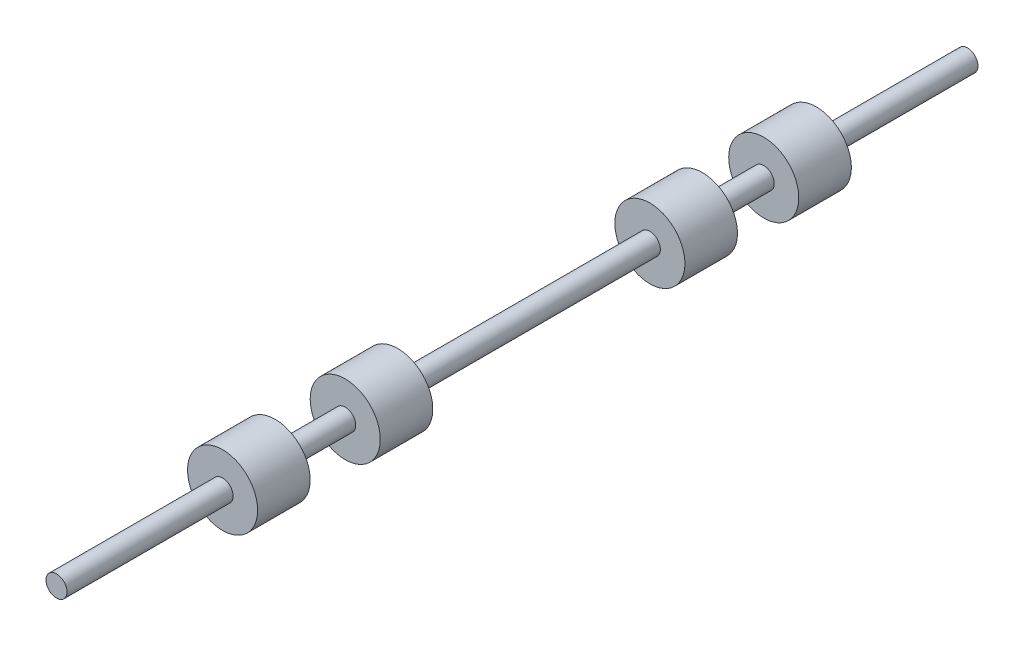
ISO-10303-21;
HEADER;
FILE_DESCRIPTION(('STEP AP214'),'2;1');
FILE_NAME('part.step','',(''),(''),'','','');
FILE_SCHEMA(('AUTOMOTIVE_DESIGN { 1 0 10303 214 1 1 1 1 }'));
ENDSEC;
DATA;
#1=APPLICATION_CONTEXT('core data for automotive mechanical design processes');
#2=APPLICATION_PROTOCOL_DEFINITION('international standard','automotive_design',2000,#1);
#3=PRODUCT_CONTEXT('',#1,'mechanical');
#4=PRODUCT('Part','Part','',(#3));
#5=PRODUCT_RELATED_PRODUCT_CATEGORY('part','',(#4));
#6=PRODUCT_DEFINITION_FORMATION('','',#4);
#7=PRODUCT_DEFINITION_CONTEXT('part definition',#1,'design');
#8=PRODUCT_DEFINITION('design','',#6,#7);
#9=PRODUCT_DEFINITION_SHAPE('','',#8);
#10=(LENGTH_UNIT() NAMED_UNIT(*) SI_UNIT(.MILLI.,.METRE.));
#11=(NAMED_UNIT(*) PLANE_ANGLE_UNIT() SI_UNIT($,.RADIAN.));
#12=(NAMED_UNIT(*) SI_UNIT($,.STERADIAN.) SOLID_ANGLE_UNIT());
#13=UNCERTAINTY_MEASURE_WITH_UNIT(LENGTH_MEASURE(1.E-05),#10,'distance_accuracy_value','');
#14=(GEOMETRIC_REPRESENTATION_CONTEXT(3) GLOBAL_UNCERTAINTY_ASSIGNED_CONTEXT((#13)) GLOBAL_UNIT_ASSIGNED_CONTEXT((#10,
#11,#12)) REPRESENTATION_CONTEXT('',''));
#15=CARTESIAN_POINT('',(0.,0.,0.));
#16=DIRECTION('',(0.,0.,1.));
#17=DIRECTION('',(1.,0.,0.));
#18=AXIS2_PLACEMENT_3D('',#15,#16,#17);
#19=CARTESIAN_POINT('',(0.,0.,26.));
#20=DIRECTION('',(0.,0.,-1.));
#21=DIRECTION('',(-1.,0.,0.));
#22=AXIS2_PLACEMENT_3D('',#19,#20,#21);
#23=CYLINDRICAL_SURFACE('',#22,0.3);
#24=CARTESIAN_POINT('',(0.,0.,17.76));
#25=DIRECTION('',(0.,0.,-1.));
#26=DIRECTION('',(-1.,0.,0.));
#27=AXIS2_PLACEMENT_3D('',#24,#25,#26);
#28=CIRCLE('',#27,0.3);
#29=CARTESIAN_POINT('',(-0.3,0.,17.76));
#30=VERTEX_POINT('',#29);
#31=EDGE_CURVE('E42',#30,#30,#28,.T.);
#32=ORIENTED_EDGE('',*,*,#31,.F.);
#33=EDGE_LOOP('',(#32));
#34=FACE_BOUND('',#33,.T.);
#35=CARTESIAN_POINT('',(0.,0.,19.76));
#36=DIRECTION('',(0.,0.,1.));
#37=DIRECTION('',(1.,0.,0.));
#38=AXIS2_PLACEMENT_3D('',#35,#36,#37);
#39=CIRCLE('',#38,0.3);
#40=CARTESIAN_POINT('',(0.3,0.,19.76));
#41=VERTEX_POINT('',#40);
#42=EDGE_CURVE('E38',#41,#41,#39,.T.);
#43=ORIENTED_EDGE('',*,*,#42,.F.);
#44=EDGE_LOOP('',(#43));
#45=FACE_BOUND('',#44,.T.);
#46=ADVANCED_FACE('F31',(#34,#45),#23,.T.);
#47=CARTESIAN_POINT('',(0.,0.,9.06498723388908));
#48=DIRECTION('',(0.,0.,-1.));
#49=DIRECTION('',(-1.,0.,0.));
#50=AXIS2_PLACEMENT_3D('',#47,#48,#49);
#51=CIRCLE('',#50,0.3);
#52=CARTESIAN_POINT('',(-0.3,0.,9.06498723388908));
#53=VERTEX_POINT('',#52);
#54=EDGE_CURVE('E51',#53,#53,#51,.T.);
#55=ORIENTED_EDGE('',*,*,#54,.F.);
#56=EDGE_LOOP('',(#55));
#57=FACE_BOUND('',#56,.T.);
#58=CARTESIAN_POINT('',(0.,0.,16.26));
#59=DIRECTION('',(0.,0.,1.));
#60=DIRECTION('',(1.,0.,0.));
#61=AXIS2_PLACEMENT_3D('',#58,#59,#60);
#62=CIRCLE('',#61,0.3);
#63=CARTESIAN_POINT('',(0.3,0.,16.26));
#64=VERTEX_POINT('',#63);
#65=EDGE_CURVE('E46',#64,#64,#62,.T.);
#66=ORIENTED_EDGE('',*,*,#65,.F.);
#67=EDGE_LOOP('',(#66));
#68=FACE_BOUND('',#67,.T.);
#69=ADVANCED_FACE('F113',(#57,#68),#23,.T.);
#70=CARTESIAN_POINT('',(0.,0.,5.81501276611092));
#71=DIRECTION('',(0.,0.,-1.));
#72=DIRECTION('',(-1.,0.,0.));
#73=AXIS2_PLACEMENT_3D('',#70,#71,#72);
#74=CIRCLE('',#73,0.3);
#75=CARTESIAN_POINT('',(-0.3,0.,5.81501276611092));
#76=VERTEX_POINT('',#75);
#77=EDGE_CURVE('E57',#76,#76,#74,.T.);
#78=ORIENTED_EDGE('',*,*,#77,.F.);
#79=EDGE_LOOP('',(#78));
#80=FACE_BOUND('',#79,.T.);
#81=CARTESIAN_POINT('',(0.,0.,7.56498723388908));
#82=DIRECTION('',(0.,0.,1.));
#83=DIRECTION('',(1.,0.,0.));
#84=AXIS2_PLACEMENT_3D('',#81,#82,#83);
#85=CIRCLE('',#84,0.3);
#86=CARTESIAN_POINT('',(0.3,0.,7.56498723388908));
#87=VERTEX_POINT('',#86);
#88=EDGE_CURVE('E54',#87,#87,#85,.T.);
#89=ORIENTED_EDGE('',*,*,#88,.F.);
#90=EDGE_LOOP('',(#89));
#91=FACE_BOUND('',#90,.T.);
#92=ADVANCED_FACE('F118',(#80,#91),#23,.T.);
#93=CARTESIAN_POINT('',(0.,0.,5.81501276611092));
#94=DIRECTION('',(0.,0.,-1.));
#95=DIRECTION('',(-1.,0.,0.));
#96=AXIS2_PLACEMENT_3D('',#93,#94,#95);
#97=PLANE('',#96);
#98=ORIENTED_EDGE('',*,*,#77,.T.);
#99=EDGE_LOOP('',(#98));
#100=FACE_BOUND('',#99,.T.);
#101=CARTESIAN_POINT('',(0.,0.,5.81501276611092));
#102=DIRECTION('',(0.,0.,-1.));
#103=DIRECTION('',(-1.,0.,0.));
#104=AXIS2_PLACEMENT_3D('',#101,#102,#103);
#105=CIRCLE('',#104,1.);
#106=CARTESIAN_POINT('',(-1.,0.,5.81501276611092));
#107=VERTEX_POINT('',#106);
#108=EDGE_CURVE('E67',#107,#107,#105,.T.);
#109=ORIENTED_EDGE('',*,*,#108,.F.);
#110=EDGE_LOOP('',(#109));
#111=FACE_BOUND('',#110,.T.);
#112=ADVANCED_FACE('F148',(#100,#111),#97,.F.);
#113=CARTESIAN_POINT('',(0.,0.,0.));
#114=DIRECTION('',(0.,0.,-1.));
#115=DIRECTION('',(-1.,0.,0.));
#116=AXIS2_PLACEMENT_3D('',#113,#114,#115);
#117=CYLINDRICAL_SURFACE('',#116,1.);
#118=CARTESIAN_POINT('',(0.,0.,4.31501276611092));
#119=DIRECTION('',(0.,0.,-1.));
#120=DIRECTION('',(-1.,0.,0.));
#121=AXIS2_PLACEMENT_3D('',#118,#119,#120);
#122=CIRCLE('',#121,1.);
#123=CARTESIAN_POINT('',(-1.,0.,4.31501276611092));
#124=VERTEX_POINT('',#123);
#125=EDGE_CURVE('E72',#124,#124,#122,.T.);
#126=ORIENTED_EDGE('',*,*,#125,.F.);
#127=EDGE_LOOP('',(#126));
#128=FACE_BOUND('',#127,.T.);
#129=ORIENTED_EDGE('',*,*,#108,.T.);
#130=EDGE_LOOP('',(#129));
#131=FACE_BOUND('',#130,.T.);
#132=ADVANCED_FACE('F153',(#128,#131),#117,.T.);
#133=CARTESIAN_POINT('',(0.,0.,4.31501276611092));
#134=DIRECTION('',(0.,0.,1.));
#135=DIRECTION('',(1.,0.,0.));
#136=AXIS2_PLACEMENT_3D('',#133,#134,#135);
#137=PLANE('',#136);
#138=CARTESIAN_POINT('',(0.,0.,4.31501276611092));
#139=DIRECTION('',(0.,0.,1.));
#140=DIRECTION('',(1.,0.,0.));
#141=AXIS2_PLACEMENT_3D('',#138,#139,#140);
#142=CIRCLE('',#141,0.3);
#143=CARTESIAN_POINT('',(0.3,0.,4.31501276611092));
#144=VERTEX_POINT('',#143);
#145=EDGE_CURVE('E60',#144,#144,#142,.T.);
#146=ORIENTED_EDGE('',*,*,#145,.T.);
#147=EDGE_LOOP('',(#146));
#148=FACE_BOUND('',#147,.T.);
#149=ORIENTED_EDGE('',*,*,#125,.T.);
#150=EDGE_LOOP('',(#149));
#151=FACE_BOUND('',#150,.T.);
#152=ADVANCED_FACE('F144',(#148,#151),#137,.F.);
#153=CARTESIAN_POINT('',(0.,0.,0.));
#154=DIRECTION('',(0.,0.,1.));
#155=DIRECTION('',(1.,0.,0.));
#156=AXIS2_PLACEMENT_3D('',#153,#154,#155);
#157=PLANE('',#156);
#158=CARTESIAN_POINT('',(0.,0.,0.));
#159=DIRECTION('',(0.,0.,1.));
#160=DIRECTION('',(1.,0.,0.));
#161=AXIS2_PLACEMENT_3D('',#158,#159,#160);
#162=CIRCLE('',#161,0.3);
#163=CARTESIAN_POINT('',(0.3,0.,0.));
#164=VERTEX_POINT('',#163);
#165=EDGE_CURVE('E64',#164,#164,#162,.T.);
#166=ORIENTED_EDGE('',*,*,#165,.F.);
#167=EDGE_LOOP('',(#166));
#168=FACE_BOUND('',#167,.T.);
#169=ADVANCED_FACE('F135',(#168),#157,.F.);
#170=ORIENTED_EDGE('',*,*,#165,.T.);
#171=EDGE_LOOP('',(#170));
#172=FACE_BOUND('',#171,.T.);
#173=ORIENTED_EDGE('',*,*,#145,.F.);
#174=EDGE_LOOP('',(#173));
#175=FACE_BOUND('',#174,.T.);
#176=ADVANCED_FACE('F125',(#172,#175),#23,.T.);
#177=CARTESIAN_POINT('',(0.,0.,9.06498723388908));
#178=DIRECTION('',(0.,0.,-1.));
#179=DIRECTION('',(-1.,0.,0.));
#180=AXIS2_PLACEMENT_3D('',#177,#178,#179);
#181=PLANE('',#180);
#182=ORIENTED_EDGE('',*,*,#54,.T.);
#183=EDGE_LOOP('',(#182));
#184=FACE_BOUND('',#183,.T.);
#185=CARTESIAN_POINT('',(0.,0.,9.06498723388908));
#186=DIRECTION('',(0.,0.,-1.));
#187=DIRECTION('',(-1.,0.,0.));
#188=AXIS2_PLACEMENT_3D('',#185,#186,#187);
#189=CIRCLE('',#188,1.);
#190=CARTESIAN_POINT('',(-1.,0.,9.06498723388908));
#191=VERTEX_POINT('',#190);
#192=EDGE_CURVE('E75',#191,#191,#189,.T.);
#193=ORIENTED_EDGE('',*,*,#192,.F.);
#194=EDGE_LOOP('',(#193));
#195=FACE_BOUND('',#194,.T.);
#196=ADVANCED_FACE('F134',(#184,#195),#181,.F.);
#197=CARTESIAN_POINT('',(0.,0.,0.));
#198=DIRECTION('',(0.,0.,-1.));
#199=DIRECTION('',(-1.,0.,0.));
#200=AXIS2_PLACEMENT_3D('',#197,#198,#199);
#201=CYLINDRICAL_SURFACE('',#200,1.);
#202=CARTESIAN_POINT('',(0.,0.,7.56498723388908));
#203=DIRECTION('',(0.,0.,-1.));
#204=DIRECTION('',(-1.,0.,0.));
#205=AXIS2_PLACEMENT_3D('',#202,#203,#204);
#206=CIRCLE('',#205,1.);
#207=CARTESIAN_POINT('',(-1.,0.,7.56498723388908));
#208=VERTEX_POINT('',#207);
#209=EDGE_CURVE('E78',#208,#208,#206,.T.);
#210=ORIENTED_EDGE('',*,*,#209,.F.);
#211=EDGE_LOOP('',(#210));
#212=FACE_BOUND('',#211,.T.);
#213=ORIENTED_EDGE('',*,*,#192,.T.);
#214=EDGE_LOOP('',(#213));
#215=FACE_BOUND('',#214,.T.);
#216=ADVANCED_FACE('F141',(#212,#215),#201,.T.);
#217=CARTESIAN_POINT('',(0.,0.,7.56498723388908));
#218=DIRECTION('',(0.,0.,1.));
#219=DIRECTION('',(1.,0.,0.));
#220=AXIS2_PLACEMENT_3D('',#217,#218,#219);
#221=PLANE('',#220);
#222=ORIENTED_EDGE('',*,*,#88,.T.);
#223=EDGE_LOOP('',(#222));
#224=FACE_BOUND('',#223,.T.);
#225=ORIENTED_EDGE('',*,*,#209,.T.);
#226=EDGE_LOOP('',(#225));
#227=FACE_BOUND('',#226,.T.);
#228=ADVANCED_FACE('F160',(#224,#227),#221,.F.);
#229=CARTESIAN_POINT('',(0.,0.,17.76));
#230=DIRECTION('',(0.,0.,-1.));
#231=DIRECTION('',(-1.,0.,0.));
#232=AXIS2_PLACEMENT_3D('',#229,#230,#231);
#233=PLANE('',#232);
#234=ORIENTED_EDGE('',*,*,#31,.T.);
#235=EDGE_LOOP('',(#234));
#236=FACE_BOUND('',#235,.T.);
#237=CARTESIAN_POINT('',(0.,0.,17.76));
#238=DIRECTION('',(0.,0.,-1.));
#239=DIRECTION('',(-1.,0.,0.));
#240=AXIS2_PLACEMENT_3D('',#237,#238,#239);
#241=CIRCLE('',#240,1.);
#242=CARTESIAN_POINT('',(-1.,0.,17.76));
#243=VERTEX_POINT('',#242);
#244=EDGE_CURVE('E81',#243,#243,#241,.T.);
#245=ORIENTED_EDGE('',*,*,#244,.F.);
#246=EDGE_LOOP('',(#245));
#247=FACE_BOUND('',#246,.T.);
#248=ADVANCED_FACE('F163',(#236,#247),#233,.F.);
#249=CARTESIAN_POINT('',(0.,0.,0.));
#250=DIRECTION('',(0.,0.,-1.));
#251=DIRECTION('',(-1.,0.,0.));
#252=AXIS2_PLACEMENT_3D('',#249,#250,#251);
#253=CYLINDRICAL_SURFACE('',#252,1.);
#254=CARTESIAN_POINT('',(0.,0.,16.26));
#255=DIRECTION('',(0.,0.,-1.));
#256=DIRECTION('',(-1.,0.,0.));
#257=AXIS2_PLACEMENT_3D('',#254,#255,#256);
#258=CIRCLE('',#257,1.);
#259=CARTESIAN_POINT('',(-1.,0.,16.26));
#260=VERTEX_POINT('',#259);
#261=EDGE_CURVE('E84',#260,#260,#258,.T.);
#262=ORIENTED_EDGE('',*,*,#261,.F.);
#263=EDGE_LOOP('',(#262));
#264=FACE_BOUND('',#263,.T.);
#265=ORIENTED_EDGE('',*,*,#244,.T.);
#266=EDGE_LOOP('',(#265));
#267=FACE_BOUND('',#266,.T.);
#268=ADVANCED_FACE('F109',(#264,#267),#253,.T.);
#269=CARTESIAN_POINT('',(0.,0.,16.26));
#270=DIRECTION('',(0.,0.,1.));
#271=DIRECTION('',(1.,0.,0.));
#272=AXIS2_PLACEMENT_3D('',#269,#270,#271);
#273=PLANE('',#272);
#274=ORIENTED_EDGE('',*,*,#65,.T.);
#275=EDGE_LOOP('',(#274));
#276=FACE_BOUND('',#275,.T.);
#277=ORIENTED_EDGE('',*,*,#261,.T.);
#278=EDGE_LOOP('',(#277));
#279=FACE_BOUND('',#278,.T.);
#280=ADVANCED_FACE('F104',(#276,#279),#273,.F.);
#281=CARTESIAN_POINT('',(0.,0.,21.26));
#282=DIRECTION('',(0.,0.,-1.));
#283=DIRECTION('',(-1.,0.,0.));
#284=AXIS2_PLACEMENT_3D('',#281,#282,#283);
#285=PLANE('',#284);
#286=CARTESIAN_POINT('',(0.,0.,21.26));
#287=DIRECTION('',(0.,0.,-1.));
#288=DIRECTION('',(-1.,0.,0.));
#289=AXIS2_PLACEMENT_3D('',#286,#287,#288);
#290=CIRCLE('',#289,0.3);
#291=CARTESIAN_POINT('',(-0.3,0.,21.26));
#292=VERTEX_POINT('',#291);
#293=EDGE_CURVE('E10',#292,#292,#290,.T.);
#294=ORIENTED_EDGE('',*,*,#293,.T.);
#295=EDGE_LOOP('',(#294));
#296=FACE_BOUND('',#295,.T.);
#297=CARTESIAN_POINT('',(0.,0.,21.26));
#298=DIRECTION('',(0.,0.,-1.));
#299=DIRECTION('',(-1.,0.,0.));
#300=AXIS2_PLACEMENT_3D('',#297,#298,#299);
#301=CIRCLE('',#300,1.);
#302=CARTESIAN_POINT('',(-1.,0.,21.26));
#303=VERTEX_POINT('',#302);
#304=EDGE_CURVE('E87',#303,#303,#301,.T.);
#305=ORIENTED_EDGE('',*,*,#304,.F.);
#306=EDGE_LOOP('',(#305));
#307=FACE_BOUND('',#306,.T.);
#308=ADVANCED_FACE('F99',(#296,#307),#285,.F.);
#309=CARTESIAN_POINT('',(0.,0.,0.));
#310=DIRECTION('',(0.,0.,-1.));
#311=DIRECTION('',(-1.,0.,0.));
#312=AXIS2_PLACEMENT_3D('',#309,#310,#311);
#313=CYLINDRICAL_SURFACE('',#312,1.);
#314=CARTESIAN_POINT('',(0.,0.,19.76));
#315=DIRECTION('',(0.,0.,-1.));
#316=DIRECTION('',(-1.,0.,0.));
#317=AXIS2_PLACEMENT_3D('',#314,#315,#316);
#318=CIRCLE('',#317,1.);
#319=CARTESIAN_POINT('',(-1.,0.,19.76));
#320=VERTEX_POINT('',#319);
#321=EDGE_CURVE('E90',#320,#320,#318,.T.);
#322=ORIENTED_EDGE('',*,*,#321,.F.);
#323=EDGE_LOOP('',(#322));
#324=FACE_BOUND('',#323,.T.);
#325=ORIENTED_EDGE('',*,*,#304,.T.);
#326=EDGE_LOOP('',(#325));
#327=FACE_BOUND('',#326,.T.);
#328=ADVANCED_FACE('F96',(#324,#327),#313,.T.);
#329=CARTESIAN_POINT('',(0.,0.,19.76));
#330=DIRECTION('',(0.,0.,1.));
#331=DIRECTION('',(1.,0.,0.));
#332=AXIS2_PLACEMENT_3D('',#329,#330,#331);
#333=PLANE('',#332);
#334=ORIENTED_EDGE('',*,*,#42,.T.);
#335=EDGE_LOOP('',(#334));
#336=FACE_BOUND('',#335,.T.);
#337=ORIENTED_EDGE('',*,*,#321,.T.);
#338=EDGE_LOOP('',(#337));
#339=FACE_BOUND('',#338,.T.);
#340=ADVANCED_FACE('F94',(#336,#339),#333,.F.);
#341=CARTESIAN_POINT('',(0.,0.,26.));
#342=DIRECTION('',(0.,0.,1.));
#343=DIRECTION('',(1.,0.,0.));
#344=AXIS2_PLACEMENT_3D('',#341,#342,#343);
#345=PLANE('',#344);
#346=CARTESIAN_POINT('',(0.,0.,26.));
#347=DIRECTION('',(0.,0.,1.));
#348=DIRECTION('',(1.,0.,0.));
#349=AXIS2_PLACEMENT_3D('',#346,#347,#348);
#350=CIRCLE('',#349,0.3);
#351=CARTESIAN_POINT('',(0.3,0.,26.));
#352=VERTEX_POINT('',#351);
#353=EDGE_CURVE('E63',#352,#352,#350,.T.);
#354=ORIENTED_EDGE('',*,*,#353,.T.);
#355=EDGE_LOOP('',(#354));
#356=FACE_BOUND('',#355,.T.);
#357=ADVANCED_FACE('F123',(#356),#345,.T.);
#358=ORIENTED_EDGE('',*,*,#353,.F.);
#359=EDGE_LOOP('',(#358));
#360=FACE_BOUND('',#359,.T.);
#361=ORIENTED_EDGE('',*,*,#293,.F.);
#362=EDGE_LOOP('',(#361));
#363=FACE_BOUND('',#362,.T.);
#364=ADVANCED_FACE('F33',(#360,#363),#23,.T.);
#365=CLOSED_SHELL('',(#46,#69,#92,#112,#132,#152,#169,#176,#196,#216,#228,#248,#268,#280,#308,
#328,#340,#357,#364));
#366=MANIFOLD_SOLID_BREP('B2',#365);
#367=ADVANCED_BREP_SHAPE_REPRESENTATION('',(#18,#366),#14);
#368=SHAPE_DEFINITION_REPRESENTATION(#9,#367);
ENDSEC;
END-ISO-10303-21;
